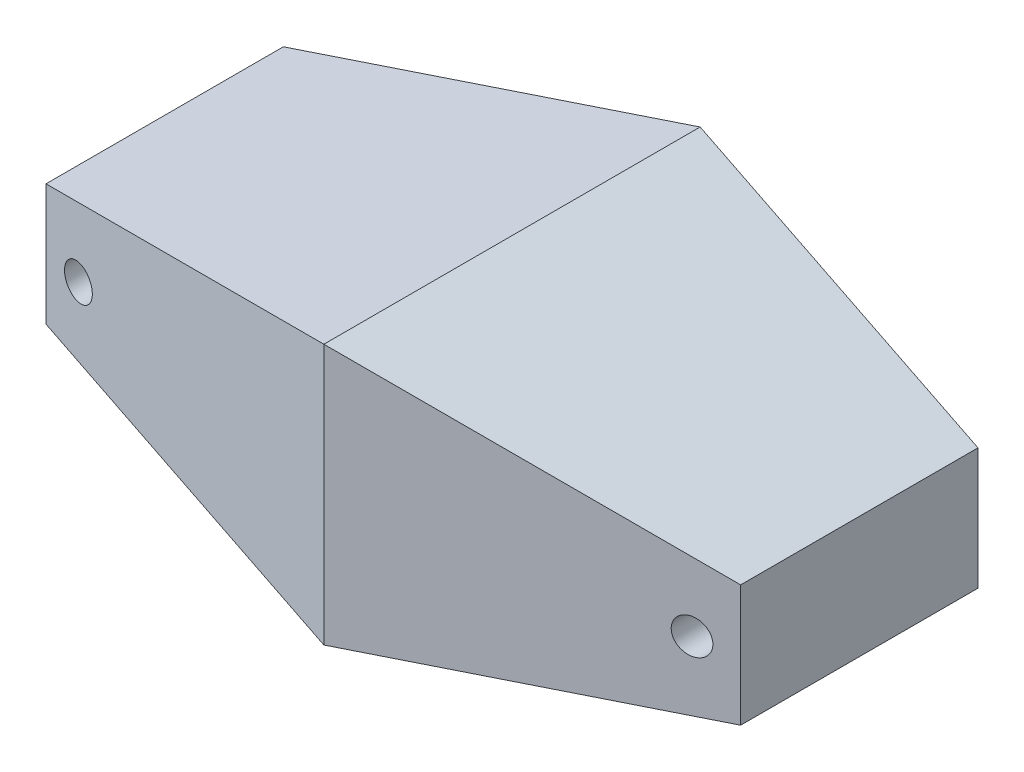
ISO-10303-21;
HEADER;
FILE_DESCRIPTION(('STEP AP214'),'2;1');
FILE_NAME('part.step','',(''),(''),'','','');
FILE_SCHEMA(('AUTOMOTIVE_DESIGN { 1 0 10303 214 1 1 1 1 }'));
ENDSEC;
DATA;
#1=APPLICATION_CONTEXT('core data for automotive mechanical design processes');
#2=APPLICATION_PROTOCOL_DEFINITION('international standard','automotive_design',2000,#1);
#3=PRODUCT_CONTEXT('',#1,'mechanical');
#4=PRODUCT('Part','Part','',(#3));
#5=PRODUCT_RELATED_PRODUCT_CATEGORY('part','',(#4));
#6=PRODUCT_DEFINITION_FORMATION('','',#4);
#7=PRODUCT_DEFINITION_CONTEXT('part definition',#1,'design');
#8=PRODUCT_DEFINITION('design','',#6,#7);
#9=PRODUCT_DEFINITION_SHAPE('','',#8);
#10=(LENGTH_UNIT() NAMED_UNIT(*) SI_UNIT(.MILLI.,.METRE.));
#11=(NAMED_UNIT(*) PLANE_ANGLE_UNIT() SI_UNIT($,.RADIAN.));
#12=(NAMED_UNIT(*) SI_UNIT($,.STERADIAN.) SOLID_ANGLE_UNIT());
#13=UNCERTAINTY_MEASURE_WITH_UNIT(LENGTH_MEASURE(1.E-05),#10,'distance_accuracy_value','');
#14=(GEOMETRIC_REPRESENTATION_CONTEXT(3) GLOBAL_UNCERTAINTY_ASSIGNED_CONTEXT((#13)) GLOBAL_UNIT_ASSIGNED_CONTEXT((#10,
#11,#12)) REPRESENTATION_CONTEXT('',''));
#15=CARTESIAN_POINT('',(0.,0.,0.));
#16=DIRECTION('',(0.,0.,1.));
#17=DIRECTION('',(1.,0.,0.));
#18=AXIS2_PLACEMENT_3D('',#15,#16,#17);
#19=CARTESIAN_POINT('',(60.,-22.5,65.));
#20=DIRECTION('',(-1.,0.,0.));
#21=DIRECTION('',(0.,0.,1.));
#22=AXIS2_PLACEMENT_3D('',#19,#20,#21);
#23=PLANE('',#22);
#24=DIRECTION('',(0.,0.,-1.));
#25=VECTOR('',#24,1.);
#26=CARTESIAN_POINT('',(60.,10.5,65.));
#27=LINE('',#26,#25);
#28=CARTESIAN_POINT('',(60.,10.5,53.));
#29=VERTEX_POINT('',#28);
#30=CARTESIAN_POINT('',(60.,10.5,12.));
#31=VERTEX_POINT('',#30);
#32=EDGE_CURVE('E221',#29,#31,#27,.T.);
#33=ORIENTED_EDGE('',*,*,#32,.F.);
#34=DIRECTION('',(0.,1.,0.));
#35=VECTOR('',#34,1.);
#36=CARTESIAN_POINT('',(60.,-42.5,53.));
#37=LINE('',#36,#35);
#38=CARTESIAN_POINT('',(60.,-10.5,53.));
#39=VERTEX_POINT('',#38);
#40=EDGE_CURVE('E182',#39,#29,#37,.T.);
#41=ORIENTED_EDGE('',*,*,#40,.F.);
#42=DIRECTION('',(0.,0.,-1.));
#43=VECTOR('',#42,1.);
#44=CARTESIAN_POINT('',(60.,-10.5,65.));
#45=LINE('',#44,#43);
#46=CARTESIAN_POINT('',(60.,-10.5,12.));
#47=VERTEX_POINT('',#46);
#48=EDGE_CURVE('E224',#39,#47,#45,.T.);
#49=ORIENTED_EDGE('',*,*,#48,.T.);
#50=DIRECTION('',(0.,1.,0.));
#51=VECTOR('',#50,1.);
#52=CARTESIAN_POINT('',(60.,-42.5,12.));
#53=LINE('',#52,#51);
#54=EDGE_CURVE('E248',#47,#31,#53,.T.);
#55=ORIENTED_EDGE('',*,*,#54,.T.);
#56=EDGE_LOOP('',(#33,#41,#49,#55));
#57=FACE_BOUND('',#56,.T.);
#58=ADVANCED_FACE('F110',(#57),#23,.F.);
#59=CARTESIAN_POINT('',(12.5,-42.5,62.5));
#60=DIRECTION('',(0.196116135138184,0.,0.98058067569092));
#61=DIRECTION('',(0.98058067569092,0.,-0.196116135138184));
#62=AXIS2_PLACEMENT_3D('',#59,#60,#61);
#63=PLANE('',#62);
#64=CARTESIAN_POINT('',(53.0000000000001,0.,54.4));
#65=DIRECTION('',(0.196116135138184,0.,0.98058067569092));
#66=DIRECTION('',(0.98058067569092,0.,-0.196116135138184));
#67=AXIS2_PLACEMENT_3D('',#64,#65,#66);
#68=ELLIPSE('',#67,3.05941170815567,3.);
#69=CARTESIAN_POINT('',(56.0000000000001,0.,53.8));
#70=VERTEX_POINT('',#69);
#71=EDGE_CURVE('E215',#70,#70,#68,.F.);
#72=ORIENTED_EDGE('',*,*,#71,.T.);
#73=EDGE_LOOP('',(#72));
#74=FACE_BOUND('',#73,.T.);
#75=ORIENTED_EDGE('',*,*,#40,.T.);
#76=DIRECTION('',(-0.962250448649376,0.192450089729875,0.192450089729876));
#77=VECTOR('',#76,1.);
#78=CARTESIAN_POINT('',(24.0740740740741,17.6851851851852,60.1851851851852));
#79=LINE('',#78,#77);
#80=CARTESIAN_POINT('',(0.,22.5,65.));
#81=VERTEX_POINT('',#80);
#82=EDGE_CURVE('E167',#29,#81,#79,.T.);
#83=ORIENTED_EDGE('',*,*,#82,.T.);
#84=DIRECTION('',(0.,-1.,0.));
#85=VECTOR('',#84,1.);
#86=CARTESIAN_POINT('',(0.,0.,65.));
#87=LINE('',#86,#85);
#88=CARTESIAN_POINT('',(0.,-22.5,65.));
#89=VERTEX_POINT('',#88);
#90=EDGE_CURVE('E180',#81,#89,#87,.T.);
#91=ORIENTED_EDGE('',*,*,#90,.T.);
#92=DIRECTION('',(-0.962250448649376,-0.192450089729875,0.192450089729876));
#93=VECTOR('',#92,1.);
#94=CARTESIAN_POINT('',(8.33333333333335,-20.8333333333333,63.3333333333333));
#95=LINE('',#94,#93);
#96=EDGE_CURVE('E134',#39,#89,#95,.T.);
#97=ORIENTED_EDGE('',*,*,#96,.F.);
#98=EDGE_LOOP('',(#75,#83,#91,#97));
#99=FACE_BOUND('',#98,.T.);
#100=ADVANCED_FACE('F178',(#74,#99),#63,.T.);
#101=CARTESIAN_POINT('',(0.,-42.5,0.));
#102=DIRECTION('',(-0.196116135138184,0.,0.98058067569092));
#103=DIRECTION('',(0.98058067569092,0.,0.196116135138184));
#104=AXIS2_PLACEMENT_3D('',#101,#102,#103);
#105=PLANE('',#104);
#106=CARTESIAN_POINT('',(53.0000000000001,0.,10.6));
#107=DIRECTION('',(-0.196116135138184,0.,0.98058067569092));
#108=DIRECTION('',(-0.98058067569092,0.,-0.196116135138184));
#109=AXIS2_PLACEMENT_3D('',#106,#107,#108);
#110=ELLIPSE('',#109,3.05941170815567,3.);
#111=CARTESIAN_POINT('',(50.0000000000001,0.,10.));
#112=VERTEX_POINT('',#111);
#113=EDGE_CURVE('E113',#112,#112,#110,.F.);
#114=ORIENTED_EDGE('',*,*,#113,.F.);
#115=EDGE_LOOP('',(#114));
#116=FACE_BOUND('',#115,.T.);
#117=DIRECTION('',(-0.962250448649376,0.192450089729875,-0.192450089729876));
#118=VECTOR('',#117,1.);
#119=CARTESIAN_POINT('',(12.037037037037,20.0925925925926,2.40740740740741));
#120=LINE('',#119,#118);
#121=CARTESIAN_POINT('',(0.,22.5,0.));
#122=VERTEX_POINT('',#121);
#123=EDGE_CURVE('E170',#31,#122,#120,.T.);
#124=ORIENTED_EDGE('',*,*,#123,.F.);
#125=ORIENTED_EDGE('',*,*,#54,.F.);
#126=DIRECTION('',(-0.962250448649376,-0.192450089729875,-0.192450089729876));
#127=VECTOR('',#126,1.);
#128=CARTESIAN_POINT('',(-3.7037037037037,-23.2407407407408,-0.740740740740742));
#129=LINE('',#128,#127);
#130=CARTESIAN_POINT('',(0.,-22.5,0.));
#131=VERTEX_POINT('',#130);
#132=EDGE_CURVE('E184',#47,#131,#129,.T.);
#133=ORIENTED_EDGE('',*,*,#132,.T.);
#134=DIRECTION('',(0.,1.,0.));
#135=VECTOR('',#134,1.);
#136=CARTESIAN_POINT('',(0.,0.,0.));
#137=LINE('',#136,#135);
#138=EDGE_CURVE('E193',#131,#122,#137,.T.);
#139=ORIENTED_EDGE('',*,*,#138,.T.);
#140=EDGE_LOOP('',(#124,#125,#133,#139));
#141=FACE_BOUND('',#140,.T.);
#142=ADVANCED_FACE('F269',(#116,#141),#105,.F.);
#143=CARTESIAN_POINT('',(-60.,-22.5,65.));
#144=DIRECTION('',(1.,0.,0.));
#145=DIRECTION('',(0.,0.,-1.));
#146=AXIS2_PLACEMENT_3D('',#143,#144,#145);
#147=PLANE('',#146);
#148=DIRECTION('',(0.,1.,0.));
#149=VECTOR('',#148,1.);
#150=CARTESIAN_POINT('',(-60.,-42.5,53.));
#151=LINE('',#150,#149);
#152=CARTESIAN_POINT('',(-60.,-10.5,53.));
#153=VERTEX_POINT('',#152);
#154=CARTESIAN_POINT('',(-60.,10.5,53.));
#155=VERTEX_POINT('',#154);
#156=EDGE_CURVE('E252',#153,#155,#151,.T.);
#157=ORIENTED_EDGE('',*,*,#156,.T.);
#158=DIRECTION('',(0.,0.,-1.));
#159=VECTOR('',#158,1.);
#160=CARTESIAN_POINT('',(-60.,10.5,65.));
#161=LINE('',#160,#159);
#162=CARTESIAN_POINT('',(-60.,10.5,12.));
#163=VERTEX_POINT('',#162);
#164=EDGE_CURVE('E127',#155,#163,#161,.T.);
#165=ORIENTED_EDGE('',*,*,#164,.T.);
#166=DIRECTION('',(0.,1.,0.));
#167=VECTOR('',#166,1.);
#168=CARTESIAN_POINT('',(-60.,-42.5,12.));
#169=LINE('',#168,#167);
#170=CARTESIAN_POINT('',(-60.,-10.5,12.));
#171=VERTEX_POINT('',#170);
#172=EDGE_CURVE('E199',#171,#163,#169,.T.);
#173=ORIENTED_EDGE('',*,*,#172,.F.);
#174=DIRECTION('',(0.,0.,-1.));
#175=VECTOR('',#174,1.);
#176=CARTESIAN_POINT('',(-60.,-10.5,65.));
#177=LINE('',#176,#175);
#178=EDGE_CURVE('E173',#153,#171,#177,.T.);
#179=ORIENTED_EDGE('',*,*,#178,.F.);
#180=EDGE_LOOP('',(#157,#165,#173,#179));
#181=FACE_BOUND('',#180,.T.);
#182=ADVANCED_FACE('F260',(#181),#147,.F.);
#183=CARTESIAN_POINT('',(0.,-42.5,0.));
#184=DIRECTION('',(-0.196116135138184,0.,-0.98058067569092));
#185=DIRECTION('',(-0.98058067569092,0.,0.196116135138184));
#186=AXIS2_PLACEMENT_3D('',#183,#184,#185);
#187=PLANE('',#186);
#188=CARTESIAN_POINT('',(-53.,0.,10.6));
#189=DIRECTION('',(-0.196116135138184,0.,-0.98058067569092));
#190=DIRECTION('',(0.98058067569092,0.,-0.196116135138184));
#191=AXIS2_PLACEMENT_3D('',#188,#189,#190);
#192=ELLIPSE('',#191,3.05941170815567,3.);
#193=CARTESIAN_POINT('',(-50.,0.,10.));
#194=VERTEX_POINT('',#193);
#195=EDGE_CURVE('E205',#194,#194,#192,.F.);
#196=ORIENTED_EDGE('',*,*,#195,.T.);
#197=EDGE_LOOP('',(#196));
#198=FACE_BOUND('',#197,.T.);
#199=DIRECTION('',(-0.962250448649376,-0.192450089729875,0.192450089729875));
#200=VECTOR('',#199,1.);
#201=CARTESIAN_POINT('',(-12.037037037037,20.0925925925926,2.4074074074074));
#202=LINE('',#201,#200);
#203=EDGE_CURVE('E245',#122,#163,#202,.T.);
#204=ORIENTED_EDGE('',*,*,#203,.F.);
#205=ORIENTED_EDGE('',*,*,#138,.F.);
#206=DIRECTION('',(-0.962250448649376,0.192450089729875,0.192450089729875));
#207=VECTOR('',#206,1.);
#208=CARTESIAN_POINT('',(3.7037037037037,-23.2407407407407,-0.74074074074074));
#209=LINE('',#208,#207);
#210=EDGE_CURVE('E239',#131,#171,#209,.T.);
#211=ORIENTED_EDGE('',*,*,#210,.T.);
#212=ORIENTED_EDGE('',*,*,#172,.T.);
#213=EDGE_LOOP('',(#204,#205,#211,#212));
#214=FACE_BOUND('',#213,.T.);
#215=ADVANCED_FACE('F267',(#198,#214),#187,.T.);
#216=CARTESIAN_POINT('',(-12.5,-42.5,62.5));
#217=DIRECTION('',(0.196116135138184,0.,-0.98058067569092));
#218=DIRECTION('',(-0.98058067569092,0.,-0.196116135138184));
#219=AXIS2_PLACEMENT_3D('',#216,#217,#218);
#220=PLANE('',#219);
#221=CARTESIAN_POINT('',(-53.,0.,54.4));
#222=DIRECTION('',(0.196116135138184,0.,-0.98058067569092));
#223=DIRECTION('',(-0.98058067569092,0.,-0.196116135138184));
#224=AXIS2_PLACEMENT_3D('',#221,#222,#223);
#225=ELLIPSE('',#224,3.05941170815567,3.);
#226=CARTESIAN_POINT('',(-56.,0.,53.8));
#227=VERTEX_POINT('',#226);
#228=EDGE_CURVE('E202',#227,#227,#225,.F.);
#229=ORIENTED_EDGE('',*,*,#228,.F.);
#230=EDGE_LOOP('',(#229));
#231=FACE_BOUND('',#230,.T.);
#232=ORIENTED_EDGE('',*,*,#90,.F.);
#233=DIRECTION('',(-0.962250448649376,-0.192450089729875,-0.192450089729875));
#234=VECTOR('',#233,1.);
#235=CARTESIAN_POINT('',(-24.0740740740741,17.6851851851852,60.1851851851852));
#236=LINE('',#235,#234);
#237=EDGE_CURVE('E12',#81,#155,#236,.T.);
#238=ORIENTED_EDGE('',*,*,#237,.T.);
#239=ORIENTED_EDGE('',*,*,#156,.F.);
#240=DIRECTION('',(-0.962250448649376,0.192450089729875,-0.192450089729875));
#241=VECTOR('',#240,1.);
#242=CARTESIAN_POINT('',(-8.33333333333333,-20.8333333333333,63.3333333333333));
#243=LINE('',#242,#241);
#244=EDGE_CURVE('E119',#89,#153,#243,.T.);
#245=ORIENTED_EDGE('',*,*,#244,.F.);
#246=EDGE_LOOP('',(#232,#238,#239,#245));
#247=FACE_BOUND('',#246,.T.);
#248=ADVANCED_FACE('F191',(#231,#247),#220,.F.);
#249=CARTESIAN_POINT('',(-4.32692307692307,-21.6346153846154,65.));
#250=DIRECTION('',(-0.196116135138184,-0.98058067569092,0.));
#251=DIRECTION('',(0.98058067569092,-0.196116135138184,0.));
#252=AXIS2_PLACEMENT_3D('',#249,#250,#251);
#253=PLANE('',#252);
#254=DIRECTION('',(0.,0.,-1.));
#255=VECTOR('',#254,1.);
#256=CARTESIAN_POINT('',(0.,-22.5,65.));
#257=LINE('',#256,#255);
#258=EDGE_CURVE('E220',#89,#131,#257,.T.);
#259=ORIENTED_EDGE('',*,*,#258,.F.);
#260=ORIENTED_EDGE('',*,*,#244,.T.);
#261=ORIENTED_EDGE('',*,*,#178,.T.);
#262=ORIENTED_EDGE('',*,*,#210,.F.);
#263=EDGE_LOOP('',(#259,#260,#261,#262));
#264=FACE_BOUND('',#263,.T.);
#265=ADVANCED_FACE('F264',(#264),#253,.T.);
#266=CARTESIAN_POINT('',(-4.32692307692307,21.6346153846154,65.));
#267=DIRECTION('',(0.196116135138184,-0.98058067569092,0.));
#268=DIRECTION('',(0.98058067569092,0.196116135138184,0.));
#269=AXIS2_PLACEMENT_3D('',#266,#267,#268);
#270=PLANE('',#269);
#271=ORIENTED_EDGE('',*,*,#203,.T.);
#272=ORIENTED_EDGE('',*,*,#164,.F.);
#273=ORIENTED_EDGE('',*,*,#237,.F.);
#274=DIRECTION('',(0.,0.,-1.));
#275=VECTOR('',#274,1.);
#276=CARTESIAN_POINT('',(0.,22.5,65.));
#277=LINE('',#276,#275);
#278=EDGE_CURVE('E164',#81,#122,#277,.T.);
#279=ORIENTED_EDGE('',*,*,#278,.T.);
#280=EDGE_LOOP('',(#271,#272,#273,#279));
#281=FACE_BOUND('',#280,.T.);
#282=ADVANCED_FACE('F186',(#281),#270,.F.);
#283=CARTESIAN_POINT('',(4.32692307692308,21.6346153846154,65.));
#284=DIRECTION('',(0.196116135138184,0.98058067569092,0.));
#285=DIRECTION('',(-0.98058067569092,0.196116135138184,0.));
#286=AXIS2_PLACEMENT_3D('',#283,#284,#285);
#287=PLANE('',#286);
#288=ORIENTED_EDGE('',*,*,#32,.T.);
#289=ORIENTED_EDGE('',*,*,#123,.T.);
#290=ORIENTED_EDGE('',*,*,#278,.F.);
#291=ORIENTED_EDGE('',*,*,#82,.F.);
#292=EDGE_LOOP('',(#288,#289,#290,#291));
#293=FACE_BOUND('',#292,.T.);
#294=ADVANCED_FACE('F166',(#293),#287,.T.);
#295=CARTESIAN_POINT('',(4.32692307692308,-21.6346153846154,65.));
#296=DIRECTION('',(-0.196116135138184,0.98058067569092,0.));
#297=DIRECTION('',(-0.98058067569092,-0.196116135138184,0.));
#298=AXIS2_PLACEMENT_3D('',#295,#296,#297);
#299=PLANE('',#298);
#300=ORIENTED_EDGE('',*,*,#96,.T.);
#301=ORIENTED_EDGE('',*,*,#258,.T.);
#302=ORIENTED_EDGE('',*,*,#132,.F.);
#303=ORIENTED_EDGE('',*,*,#48,.F.);
#304=EDGE_LOOP('',(#300,#301,#302,#303));
#305=FACE_BOUND('',#304,.T.);
#306=ADVANCED_FACE('F271',(#305),#299,.F.);
#307=CARTESIAN_POINT('',(-53.,0.,65.));
#308=DIRECTION('',(0.,0.,-1.));
#309=DIRECTION('',(-1.,0.,0.));
#310=AXIS2_PLACEMENT_3D('',#307,#308,#309);
#311=CYLINDRICAL_SURFACE('',#310,3.);
#312=ORIENTED_EDGE('',*,*,#195,.F.);
#313=EDGE_LOOP('',(#312));
#314=FACE_BOUND('',#313,.T.);
#315=ORIENTED_EDGE('',*,*,#228,.T.);
#316=EDGE_LOOP('',(#315));
#317=FACE_BOUND('',#316,.T.);
#318=ADVANCED_FACE('F332',(#314,#317),#311,.F.);
#319=CARTESIAN_POINT('',(53.0000000000001,0.,65.));
#320=DIRECTION('',(0.,0.,-1.));
#321=DIRECTION('',(-1.,0.,0.));
#322=AXIS2_PLACEMENT_3D('',#319,#320,#321);
#323=CYLINDRICAL_SURFACE('',#322,3.);
#324=ORIENTED_EDGE('',*,*,#71,.F.);
#325=EDGE_LOOP('',(#324));
#326=FACE_BOUND('',#325,.T.);
#327=ORIENTED_EDGE('',*,*,#113,.T.);
#328=EDGE_LOOP('',(#327));
#329=FACE_BOUND('',#328,.T.);
#330=ADVANCED_FACE('F338',(#326,#329),#323,.F.);
#331=CLOSED_SHELL('',(#58,#100,#142,#182,#215,#248,#265,#282,#294,#306,#318,#330));
#332=MANIFOLD_SOLID_BREP('B2',#331);
#333=ADVANCED_BREP_SHAPE_REPRESENTATION('',(#18,#332),#14);
#334=SHAPE_DEFINITION_REPRESENTATION(#9,#333);
ENDSEC;
END-ISO-10303-21;
